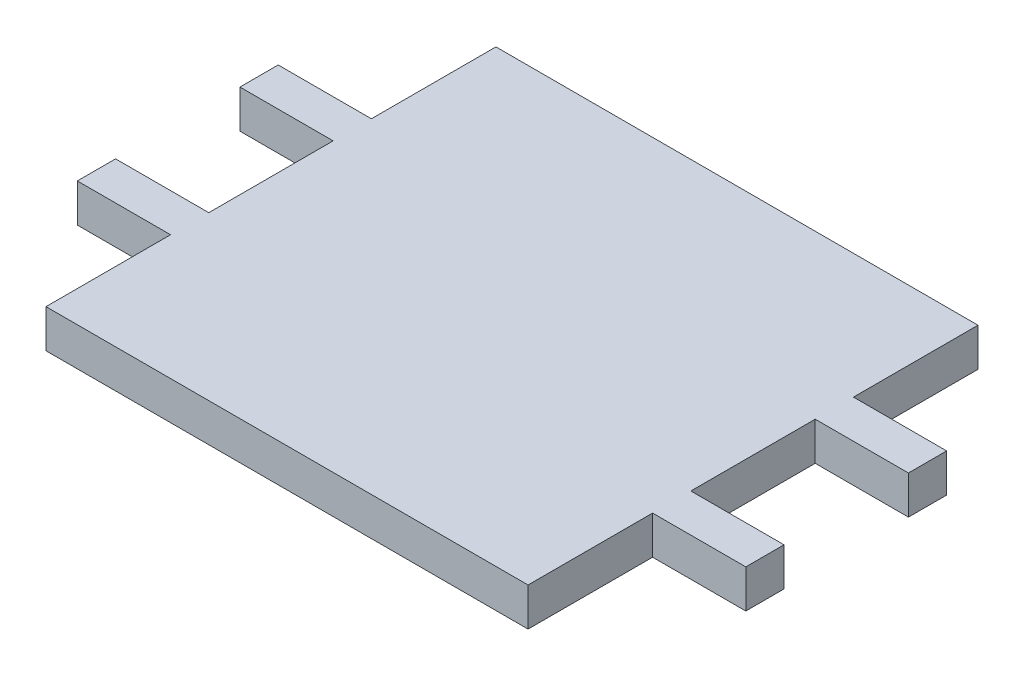
ISO-10303-21;
HEADER;
FILE_DESCRIPTION(('STEP AP214'),'2;1');
FILE_NAME('part.step','',(''),(''),'','','');
FILE_SCHEMA(('AUTOMOTIVE_DESIGN { 1 0 10303 214 1 1 1 1 }'));
ENDSEC;
DATA;
#1=APPLICATION_CONTEXT('core data for automotive mechanical design processes');
#2=APPLICATION_PROTOCOL_DEFINITION('international standard','automotive_design',2000,#1);
#3=PRODUCT_CONTEXT('',#1,'mechanical');
#4=PRODUCT('Part','Part','',(#3));
#5=PRODUCT_RELATED_PRODUCT_CATEGORY('part','',(#4));
#6=PRODUCT_DEFINITION_FORMATION('','',#4);
#7=PRODUCT_DEFINITION_CONTEXT('part definition',#1,'design');
#8=PRODUCT_DEFINITION('design','',#6,#7);
#9=PRODUCT_DEFINITION_SHAPE('','',#8);
#10=(LENGTH_UNIT() NAMED_UNIT(*) SI_UNIT(.MILLI.,.METRE.));
#11=(NAMED_UNIT(*) PLANE_ANGLE_UNIT() SI_UNIT($,.RADIAN.));
#12=(NAMED_UNIT(*) SI_UNIT($,.STERADIAN.) SOLID_ANGLE_UNIT());
#13=UNCERTAINTY_MEASURE_WITH_UNIT(LENGTH_MEASURE(1.E-05),#10,'distance_accuracy_value','');
#14=(GEOMETRIC_REPRESENTATION_CONTEXT(3) GLOBAL_UNCERTAINTY_ASSIGNED_CONTEXT((#13)) GLOBAL_UNIT_ASSIGNED_CONTEXT((#10,
#11,#12)) REPRESENTATION_CONTEXT('',''));
#15=CARTESIAN_POINT('',(0.,0.,0.));
#16=DIRECTION('',(0.,0.,1.));
#17=DIRECTION('',(1.,0.,0.));
#18=AXIS2_PLACEMENT_3D('',#15,#16,#17);
#19=CARTESIAN_POINT('',(38.1,6.0452,0.));
#20=DIRECTION('',(1.,0.,0.));
#21=DIRECTION('',(0.,0.,-1.));
#22=AXIS2_PLACEMENT_3D('',#19,#20,#21);
#23=PLANE('',#22);
#24=DIRECTION('',(0.,0.,1.));
#25=VECTOR('',#24,1.);
#26=CARTESIAN_POINT('',(38.1,0.,0.));
#27=LINE('',#26,#25);
#28=CARTESIAN_POINT('',(38.1,0.,-35.56));
#29=VERTEX_POINT('',#28);
#30=CARTESIAN_POINT('',(38.1,0.,-15.875));
#31=VERTEX_POINT('',#30);
#32=EDGE_CURVE('E211',#29,#31,#27,.T.);
#33=ORIENTED_EDGE('',*,*,#32,.F.);
#34=DIRECTION('',(0.,-1.,0.));
#35=VECTOR('',#34,1.);
#36=CARTESIAN_POINT('',(38.1,6.0452,-35.56));
#37=LINE('',#36,#35);
#38=CARTESIAN_POINT('',(38.1,6.0452,-35.56));
#39=VERTEX_POINT('',#38);
#40=EDGE_CURVE('E11',#39,#29,#37,.T.);
#41=ORIENTED_EDGE('',*,*,#40,.F.);
#42=DIRECTION('',(0.,0.,1.));
#43=VECTOR('',#42,1.);
#44=CARTESIAN_POINT('',(38.1,6.0452,0.));
#45=LINE('',#44,#43);
#46=CARTESIAN_POINT('',(38.1,6.0452,-15.875));
#47=VERTEX_POINT('',#46);
#48=EDGE_CURVE('E255',#39,#47,#45,.T.);
#49=ORIENTED_EDGE('',*,*,#48,.T.);
#50=DIRECTION('',(0.,-1.,0.));
#51=VECTOR('',#50,1.);
#52=CARTESIAN_POINT('',(38.1,6.0452,-15.875));
#53=LINE('',#52,#51);
#54=EDGE_CURVE('E133',#47,#31,#53,.T.);
#55=ORIENTED_EDGE('',*,*,#54,.T.);
#56=EDGE_LOOP('',(#33,#41,#49,#55));
#57=FACE_BOUND('',#56,.T.);
#58=ADVANCED_FACE('F46',(#57),#23,.T.);
#59=CARTESIAN_POINT('',(0.,6.0452,-35.56));
#60=DIRECTION('',(0.,0.,-1.));
#61=DIRECTION('',(-1.,0.,0.));
#62=AXIS2_PLACEMENT_3D('',#59,#60,#61);
#63=PLANE('',#62);
#64=DIRECTION('',(1.,0.,0.));
#65=VECTOR('',#64,1.);
#66=CARTESIAN_POINT('',(0.,0.,-35.56));
#67=LINE('',#66,#65);
#68=CARTESIAN_POINT('',(-38.1,0.,-35.56));
#69=VERTEX_POINT('',#68);
#70=EDGE_CURVE('E214',#69,#29,#67,.T.);
#71=ORIENTED_EDGE('',*,*,#70,.F.);
#72=DIRECTION('',(0.,-1.,0.));
#73=VECTOR('',#72,1.);
#74=CARTESIAN_POINT('',(-38.1,6.0452,-35.56));
#75=LINE('',#74,#73);
#76=CARTESIAN_POINT('',(-38.1,6.0452,-35.56));
#77=VERTEX_POINT('',#76);
#78=EDGE_CURVE('E55',#77,#69,#75,.T.);
#79=ORIENTED_EDGE('',*,*,#78,.F.);
#80=DIRECTION('',(1.,0.,0.));
#81=VECTOR('',#80,1.);
#82=CARTESIAN_POINT('',(0.,6.0452,-35.56));
#83=LINE('',#82,#81);
#84=EDGE_CURVE('E305',#77,#39,#83,.T.);
#85=ORIENTED_EDGE('',*,*,#84,.T.);
#86=ORIENTED_EDGE('',*,*,#40,.T.);
#87=EDGE_LOOP('',(#71,#79,#85,#86));
#88=FACE_BOUND('',#87,.T.);
#89=ADVANCED_FACE('F48',(#88),#63,.T.);
#90=CARTESIAN_POINT('',(-38.1,6.0452,0.));
#91=DIRECTION('',(1.,0.,0.));
#92=DIRECTION('',(0.,0.,-1.));
#93=AXIS2_PLACEMENT_3D('',#90,#91,#92);
#94=PLANE('',#93);
#95=DIRECTION('',(0.,0.,1.));
#96=VECTOR('',#95,1.);
#97=CARTESIAN_POINT('',(-38.1,0.,0.));
#98=LINE('',#97,#96);
#99=CARTESIAN_POINT('',(-38.1,0.,-15.875));
#100=VERTEX_POINT('',#99);
#101=EDGE_CURVE('E219',#69,#100,#98,.T.);
#102=ORIENTED_EDGE('',*,*,#101,.T.);
#103=DIRECTION('',(0.,-1.,0.));
#104=VECTOR('',#103,1.);
#105=CARTESIAN_POINT('',(-38.1,6.0452,-15.875));
#106=LINE('',#105,#104);
#107=CARTESIAN_POINT('',(-38.1,6.0452,-15.875));
#108=VERTEX_POINT('',#107);
#109=EDGE_CURVE('E290',#108,#100,#106,.T.);
#110=ORIENTED_EDGE('',*,*,#109,.F.);
#111=DIRECTION('',(0.,0.,1.));
#112=VECTOR('',#111,1.);
#113=CARTESIAN_POINT('',(-38.1,6.0452,0.));
#114=LINE('',#113,#112);
#115=EDGE_CURVE('E296',#77,#108,#114,.T.);
#116=ORIENTED_EDGE('',*,*,#115,.F.);
#117=ORIENTED_EDGE('',*,*,#78,.T.);
#118=EDGE_LOOP('',(#102,#110,#116,#117));
#119=FACE_BOUND('',#118,.T.);
#120=ADVANCED_FACE('F294',(#119),#94,.F.);
#121=CARTESIAN_POINT('',(0.,6.0452,-15.875));
#122=DIRECTION('',(0.,0.,-1.));
#123=DIRECTION('',(-1.,0.,0.));
#124=AXIS2_PLACEMENT_3D('',#121,#122,#123);
#125=PLANE('',#124);
#126=DIRECTION('',(1.,0.,0.));
#127=VECTOR('',#126,1.);
#128=CARTESIAN_POINT('',(0.,0.,-15.875));
#129=LINE('',#128,#127);
#130=CARTESIAN_POINT('',(-52.832,0.,-15.875));
#131=VERTEX_POINT('',#130);
#132=EDGE_CURVE('E222',#131,#100,#129,.T.);
#133=ORIENTED_EDGE('',*,*,#132,.F.);
#134=DIRECTION('',(0.,-1.,0.));
#135=VECTOR('',#134,1.);
#136=CARTESIAN_POINT('',(-52.832,6.0452,-15.875));
#137=LINE('',#136,#135);
#138=CARTESIAN_POINT('',(-52.832,6.0452,-15.875));
#139=VERTEX_POINT('',#138);
#140=EDGE_CURVE('E288',#139,#131,#137,.T.);
#141=ORIENTED_EDGE('',*,*,#140,.F.);
#142=DIRECTION('',(1.,0.,0.));
#143=VECTOR('',#142,1.);
#144=CARTESIAN_POINT('',(0.,6.0452,-15.875));
#145=LINE('',#144,#143);
#146=EDGE_CURVE('E378',#139,#108,#145,.T.);
#147=ORIENTED_EDGE('',*,*,#146,.T.);
#148=ORIENTED_EDGE('',*,*,#109,.T.);
#149=EDGE_LOOP('',(#133,#141,#147,#148));
#150=FACE_BOUND('',#149,.T.);
#151=ADVANCED_FACE('F382',(#150),#125,.T.);
#152=CARTESIAN_POINT('',(-52.832,6.0452,0.));
#153=DIRECTION('',(1.,0.,0.));
#154=DIRECTION('',(0.,0.,-1.));
#155=AXIS2_PLACEMENT_3D('',#152,#153,#154);
#156=PLANE('',#155);
#157=DIRECTION('',(0.,0.,1.));
#158=VECTOR('',#157,1.);
#159=CARTESIAN_POINT('',(-52.832,0.,0.));
#160=LINE('',#159,#158);
#161=CARTESIAN_POINT('',(-52.832,0.,-9.8298));
#162=VERTEX_POINT('',#161);
#163=EDGE_CURVE('E227',#131,#162,#160,.T.);
#164=ORIENTED_EDGE('',*,*,#163,.T.);
#165=DIRECTION('',(0.,-1.,0.));
#166=VECTOR('',#165,1.);
#167=CARTESIAN_POINT('',(-52.832,6.0452,-9.8298));
#168=LINE('',#167,#166);
#169=CARTESIAN_POINT('',(-52.832,6.0452,-9.8298));
#170=VERTEX_POINT('',#169);
#171=EDGE_CURVE('E285',#170,#162,#168,.T.);
#172=ORIENTED_EDGE('',*,*,#171,.F.);
#173=DIRECTION('',(0.,0.,1.));
#174=VECTOR('',#173,1.);
#175=CARTESIAN_POINT('',(-52.832,6.0452,0.));
#176=LINE('',#175,#174);
#177=EDGE_CURVE('E376',#139,#170,#176,.T.);
#178=ORIENTED_EDGE('',*,*,#177,.F.);
#179=ORIENTED_EDGE('',*,*,#140,.T.);
#180=EDGE_LOOP('',(#164,#172,#178,#179));
#181=FACE_BOUND('',#180,.T.);
#182=ADVANCED_FACE('F386',(#181),#156,.F.);
#183=CARTESIAN_POINT('',(0.,6.0452,-9.8298));
#184=DIRECTION('',(0.,0.,-1.));
#185=DIRECTION('',(-1.,0.,0.));
#186=AXIS2_PLACEMENT_3D('',#183,#184,#185);
#187=PLANE('',#186);
#188=DIRECTION('',(1.,0.,0.));
#189=VECTOR('',#188,1.);
#190=CARTESIAN_POINT('',(0.,0.,-9.8298));
#191=LINE('',#190,#189);
#192=CARTESIAN_POINT('',(-38.1,0.,-9.8298));
#193=VERTEX_POINT('',#192);
#194=EDGE_CURVE('E229',#162,#193,#191,.T.);
#195=ORIENTED_EDGE('',*,*,#194,.T.);
#196=DIRECTION('',(0.,-1.,0.));
#197=VECTOR('',#196,1.);
#198=CARTESIAN_POINT('',(-38.1,6.0452,-9.8298));
#199=LINE('',#198,#197);
#200=CARTESIAN_POINT('',(-38.1,6.0452,-9.8298));
#201=VERTEX_POINT('',#200);
#202=EDGE_CURVE('E282',#201,#193,#199,.T.);
#203=ORIENTED_EDGE('',*,*,#202,.F.);
#204=DIRECTION('',(1.,0.,0.));
#205=VECTOR('',#204,1.);
#206=CARTESIAN_POINT('',(0.,6.0452,-9.8298));
#207=LINE('',#206,#205);
#208=EDGE_CURVE('E373',#170,#201,#207,.T.);
#209=ORIENTED_EDGE('',*,*,#208,.F.);
#210=ORIENTED_EDGE('',*,*,#171,.T.);
#211=EDGE_LOOP('',(#195,#203,#209,#210));
#212=FACE_BOUND('',#211,.T.);
#213=ADVANCED_FACE('F389',(#212),#187,.F.);
#214=CARTESIAN_POINT('',(-38.1,0.,9.8298));
#215=VERTEX_POINT('',#214);
#216=EDGE_CURVE('E224',#193,#215,#98,.T.);
#217=ORIENTED_EDGE('',*,*,#216,.T.);
#218=DIRECTION('',(0.,-1.,0.));
#219=VECTOR('',#218,1.);
#220=CARTESIAN_POINT('',(-38.1,6.0452,9.8298));
#221=LINE('',#220,#219);
#222=CARTESIAN_POINT('',(-38.1,6.0452,9.8298));
#223=VERTEX_POINT('',#222);
#224=EDGE_CURVE('E280',#223,#215,#221,.T.);
#225=ORIENTED_EDGE('',*,*,#224,.F.);
#226=EDGE_CURVE('E325',#201,#223,#114,.T.);
#227=ORIENTED_EDGE('',*,*,#226,.F.);
#228=ORIENTED_EDGE('',*,*,#202,.T.);
#229=EDGE_LOOP('',(#217,#225,#227,#228));
#230=FACE_BOUND('',#229,.T.);
#231=ADVANCED_FACE('F359',(#230),#94,.F.);
#232=CARTESIAN_POINT('',(0.,6.0452,9.8298));
#233=DIRECTION('',(0.,0.,-1.));
#234=DIRECTION('',(-1.,0.,0.));
#235=AXIS2_PLACEMENT_3D('',#232,#233,#234);
#236=PLANE('',#235);
#237=DIRECTION('',(1.,0.,0.));
#238=VECTOR('',#237,1.);
#239=CARTESIAN_POINT('',(0.,0.,9.8298));
#240=LINE('',#239,#238);
#241=CARTESIAN_POINT('',(-52.832,0.,9.8298));
#242=VERTEX_POINT('',#241);
#243=EDGE_CURVE('E231',#242,#215,#240,.T.);
#244=ORIENTED_EDGE('',*,*,#243,.F.);
#245=DIRECTION('',(0.,-1.,0.));
#246=VECTOR('',#245,1.);
#247=CARTESIAN_POINT('',(-52.832,6.0452,9.8298));
#248=LINE('',#247,#246);
#249=CARTESIAN_POINT('',(-52.832,6.0452,9.8298));
#250=VERTEX_POINT('',#249);
#251=EDGE_CURVE('E278',#250,#242,#248,.T.);
#252=ORIENTED_EDGE('',*,*,#251,.F.);
#253=DIRECTION('',(1.,0.,0.));
#254=VECTOR('',#253,1.);
#255=CARTESIAN_POINT('',(0.,6.0452,9.8298));
#256=LINE('',#255,#254);
#257=EDGE_CURVE('E370',#250,#223,#256,.T.);
#258=ORIENTED_EDGE('',*,*,#257,.T.);
#259=ORIENTED_EDGE('',*,*,#224,.T.);
#260=EDGE_LOOP('',(#244,#252,#258,#259));
#261=FACE_BOUND('',#260,.T.);
#262=ADVANCED_FACE('F367',(#261),#236,.T.);
#263=CARTESIAN_POINT('',(-52.832,6.0452,0.));
#264=DIRECTION('',(1.,0.,0.));
#265=DIRECTION('',(0.,0.,-1.));
#266=AXIS2_PLACEMENT_3D('',#263,#264,#265);
#267=PLANE('',#266);
#268=DIRECTION('',(0.,0.,1.));
#269=VECTOR('',#268,1.);
#270=CARTESIAN_POINT('',(-52.832,0.,0.));
#271=LINE('',#270,#269);
#272=CARTESIAN_POINT('',(-52.832,0.,15.875));
#273=VERTEX_POINT('',#272);
#274=EDGE_CURVE('E234',#242,#273,#271,.T.);
#275=ORIENTED_EDGE('',*,*,#274,.T.);
#276=DIRECTION('',(0.,-1.,0.));
#277=VECTOR('',#276,1.);
#278=CARTESIAN_POINT('',(-52.832,6.0452,15.875));
#279=LINE('',#278,#277);
#280=CARTESIAN_POINT('',(-52.832,6.0452,15.875));
#281=VERTEX_POINT('',#280);
#282=EDGE_CURVE('E275',#281,#273,#279,.T.);
#283=ORIENTED_EDGE('',*,*,#282,.F.);
#284=DIRECTION('',(0.,0.,1.));
#285=VECTOR('',#284,1.);
#286=CARTESIAN_POINT('',(-52.832,6.0452,0.));
#287=LINE('',#286,#285);
#288=EDGE_CURVE('E371',#250,#281,#287,.T.);
#289=ORIENTED_EDGE('',*,*,#288,.F.);
#290=ORIENTED_EDGE('',*,*,#251,.T.);
#291=EDGE_LOOP('',(#275,#283,#289,#290));
#292=FACE_BOUND('',#291,.T.);
#293=ADVANCED_FACE('F429',(#292),#267,.F.);
#294=CARTESIAN_POINT('',(0.,6.0452,15.875));
#295=DIRECTION('',(0.,0.,-1.));
#296=DIRECTION('',(-1.,0.,0.));
#297=AXIS2_PLACEMENT_3D('',#294,#295,#296);
#298=PLANE('',#297);
#299=DIRECTION('',(1.,0.,0.));
#300=VECTOR('',#299,1.);
#301=CARTESIAN_POINT('',(0.,0.,15.875));
#302=LINE('',#301,#300);
#303=CARTESIAN_POINT('',(-38.1,0.,15.875));
#304=VERTEX_POINT('',#303);
#305=EDGE_CURVE('E236',#273,#304,#302,.T.);
#306=ORIENTED_EDGE('',*,*,#305,.T.);
#307=DIRECTION('',(0.,-1.,0.));
#308=VECTOR('',#307,1.);
#309=CARTESIAN_POINT('',(-38.1,6.0452,15.875));
#310=LINE('',#309,#308);
#311=CARTESIAN_POINT('',(-38.1,6.0452,15.875));
#312=VERTEX_POINT('',#311);
#313=EDGE_CURVE('E272',#312,#304,#310,.T.);
#314=ORIENTED_EDGE('',*,*,#313,.F.);
#315=DIRECTION('',(1.,0.,0.));
#316=VECTOR('',#315,1.);
#317=CARTESIAN_POINT('',(0.,6.0452,15.875));
#318=LINE('',#317,#316);
#319=EDGE_CURVE('E323',#281,#312,#318,.T.);
#320=ORIENTED_EDGE('',*,*,#319,.F.);
#321=ORIENTED_EDGE('',*,*,#282,.T.);
#322=EDGE_LOOP('',(#306,#314,#320,#321));
#323=FACE_BOUND('',#322,.T.);
#324=ADVANCED_FACE('F426',(#323),#298,.F.);
#325=CARTESIAN_POINT('',(-38.1,0.,35.56));
#326=VERTEX_POINT('',#325);
#327=EDGE_CURVE('E223',#304,#326,#98,.T.);
#328=ORIENTED_EDGE('',*,*,#327,.T.);
#329=DIRECTION('',(0.,-1.,0.));
#330=VECTOR('',#329,1.);
#331=CARTESIAN_POINT('',(-38.1,6.0452,35.56));
#332=LINE('',#331,#330);
#333=CARTESIAN_POINT('',(-38.1,6.0452,35.56));
#334=VERTEX_POINT('',#333);
#335=EDGE_CURVE('E269',#334,#326,#332,.T.);
#336=ORIENTED_EDGE('',*,*,#335,.F.);
#337=EDGE_CURVE('E319',#312,#334,#114,.T.);
#338=ORIENTED_EDGE('',*,*,#337,.F.);
#339=ORIENTED_EDGE('',*,*,#313,.T.);
#340=EDGE_LOOP('',(#328,#336,#338,#339));
#341=FACE_BOUND('',#340,.T.);
#342=ADVANCED_FACE('F352',(#341),#94,.F.);
#343=CARTESIAN_POINT('',(0.,6.0452,35.56));
#344=DIRECTION('',(0.,0.,-1.));
#345=DIRECTION('',(-1.,0.,0.));
#346=AXIS2_PLACEMENT_3D('',#343,#344,#345);
#347=PLANE('',#346);
#348=DIRECTION('',(1.,0.,0.));
#349=VECTOR('',#348,1.);
#350=CARTESIAN_POINT('',(0.,0.,35.56));
#351=LINE('',#350,#349);
#352=CARTESIAN_POINT('',(38.1,0.,35.56));
#353=VERTEX_POINT('',#352);
#354=EDGE_CURVE('E238',#326,#353,#351,.T.);
#355=ORIENTED_EDGE('',*,*,#354,.T.);
#356=DIRECTION('',(0.,-1.,0.));
#357=VECTOR('',#356,1.);
#358=CARTESIAN_POINT('',(38.1,6.0452,35.56));
#359=LINE('',#358,#357);
#360=CARTESIAN_POINT('',(38.1,6.0452,35.56));
#361=VERTEX_POINT('',#360);
#362=EDGE_CURVE('E267',#361,#353,#359,.T.);
#363=ORIENTED_EDGE('',*,*,#362,.F.);
#364=DIRECTION('',(1.,0.,0.));
#365=VECTOR('',#364,1.);
#366=CARTESIAN_POINT('',(0.,6.0452,35.56));
#367=LINE('',#366,#365);
#368=EDGE_CURVE('E313',#334,#361,#367,.T.);
#369=ORIENTED_EDGE('',*,*,#368,.F.);
#370=ORIENTED_EDGE('',*,*,#335,.T.);
#371=EDGE_LOOP('',(#355,#363,#369,#370));
#372=FACE_BOUND('',#371,.T.);
#373=ADVANCED_FACE('F348',(#372),#347,.F.);
#374=CARTESIAN_POINT('',(38.1,0.,15.875));
#375=VERTEX_POINT('',#374);
#376=EDGE_CURVE('E216',#375,#353,#27,.T.);
#377=ORIENTED_EDGE('',*,*,#376,.F.);
#378=DIRECTION('',(0.,-1.,0.));
#379=VECTOR('',#378,1.);
#380=CARTESIAN_POINT('',(38.1,6.0452,15.875));
#381=LINE('',#380,#379);
#382=CARTESIAN_POINT('',(38.1,6.0452,15.875));
#383=VERTEX_POINT('',#382);
#384=EDGE_CURVE('E265',#383,#375,#381,.T.);
#385=ORIENTED_EDGE('',*,*,#384,.F.);
#386=EDGE_CURVE('E308',#383,#361,#45,.T.);
#387=ORIENTED_EDGE('',*,*,#386,.T.);
#388=ORIENTED_EDGE('',*,*,#362,.T.);
#389=EDGE_LOOP('',(#377,#385,#387,#388));
#390=FACE_BOUND('',#389,.T.);
#391=ADVANCED_FACE('F346',(#390),#23,.T.);
#392=CARTESIAN_POINT('',(0.,6.0452,15.875));
#393=DIRECTION('',(0.,0.,1.));
#394=DIRECTION('',(1.,0.,0.));
#395=AXIS2_PLACEMENT_3D('',#392,#393,#394);
#396=PLANE('',#395);
#397=DIRECTION('',(-1.,0.,0.));
#398=VECTOR('',#397,1.);
#399=CARTESIAN_POINT('',(0.,0.,15.875));
#400=LINE('',#399,#398);
#401=CARTESIAN_POINT('',(52.832,0.,15.875));
#402=VERTEX_POINT('',#401);
#403=EDGE_CURVE('E241',#402,#375,#400,.T.);
#404=ORIENTED_EDGE('',*,*,#403,.F.);
#405=DIRECTION('',(0.,-1.,0.));
#406=VECTOR('',#405,1.);
#407=CARTESIAN_POINT('',(52.832,6.0452,15.875));
#408=LINE('',#407,#406);
#409=CARTESIAN_POINT('',(52.832,6.0452,15.875));
#410=VERTEX_POINT('',#409);
#411=EDGE_CURVE('E263',#410,#402,#408,.T.);
#412=ORIENTED_EDGE('',*,*,#411,.F.);
#413=DIRECTION('',(-1.,0.,0.));
#414=VECTOR('',#413,1.);
#415=CARTESIAN_POINT('',(0.,6.0452,15.875));
#416=LINE('',#415,#414);
#417=EDGE_CURVE('E312',#410,#383,#416,.T.);
#418=ORIENTED_EDGE('',*,*,#417,.T.);
#419=ORIENTED_EDGE('',*,*,#384,.T.);
#420=EDGE_LOOP('',(#404,#412,#418,#419));
#421=FACE_BOUND('',#420,.T.);
#422=ADVANCED_FACE('F407',(#421),#396,.T.);
#423=CARTESIAN_POINT('',(52.832,6.0452,0.));
#424=DIRECTION('',(1.,0.,0.));
#425=DIRECTION('',(0.,0.,-1.));
#426=AXIS2_PLACEMENT_3D('',#423,#424,#425);
#427=PLANE('',#426);
#428=DIRECTION('',(0.,0.,1.));
#429=VECTOR('',#428,1.);
#430=CARTESIAN_POINT('',(52.832,0.,0.));
#431=LINE('',#430,#429);
#432=CARTESIAN_POINT('',(52.832,0.,9.82979999999999));
#433=VERTEX_POINT('',#432);
#434=EDGE_CURVE('E244',#433,#402,#431,.T.);
#435=ORIENTED_EDGE('',*,*,#434,.F.);
#436=DIRECTION('',(0.,-1.,0.));
#437=VECTOR('',#436,1.);
#438=CARTESIAN_POINT('',(52.832,6.0452,9.82979999999999));
#439=LINE('',#438,#437);
#440=CARTESIAN_POINT('',(52.832,6.0452,9.82979999999999));
#441=VERTEX_POINT('',#440);
#442=EDGE_CURVE('E261',#441,#433,#439,.T.);
#443=ORIENTED_EDGE('',*,*,#442,.F.);
#444=DIRECTION('',(0.,0.,1.));
#445=VECTOR('',#444,1.);
#446=CARTESIAN_POINT('',(52.832,6.0452,0.));
#447=LINE('',#446,#445);
#448=EDGE_CURVE('E317',#441,#410,#447,.T.);
#449=ORIENTED_EDGE('',*,*,#448,.T.);
#450=ORIENTED_EDGE('',*,*,#411,.T.);
#451=EDGE_LOOP('',(#435,#443,#449,#450));
#452=FACE_BOUND('',#451,.T.);
#453=ADVANCED_FACE('F413',(#452),#427,.T.);
#454=CARTESIAN_POINT('',(0.,6.0452,9.8298));
#455=DIRECTION('',(0.,0.,1.));
#456=DIRECTION('',(1.,0.,0.));
#457=AXIS2_PLACEMENT_3D('',#454,#455,#456);
#458=PLANE('',#457);
#459=DIRECTION('',(-1.,0.,0.));
#460=VECTOR('',#459,1.);
#461=CARTESIAN_POINT('',(0.,0.,9.8298));
#462=LINE('',#461,#460);
#463=CARTESIAN_POINT('',(38.1,0.,9.82979999999999));
#464=VERTEX_POINT('',#463);
#465=EDGE_CURVE('E247',#433,#464,#462,.T.);
#466=ORIENTED_EDGE('',*,*,#465,.T.);
#467=DIRECTION('',(0.,-1.,0.));
#468=VECTOR('',#467,1.);
#469=CARTESIAN_POINT('',(38.1,6.0452,9.82979999999999));
#470=LINE('',#469,#468);
#471=CARTESIAN_POINT('',(38.1,6.0452,9.82979999999999));
#472=VERTEX_POINT('',#471);
#473=EDGE_CURVE('E259',#472,#464,#470,.T.);
#474=ORIENTED_EDGE('',*,*,#473,.F.);
#475=DIRECTION('',(-1.,0.,0.));
#476=VECTOR('',#475,1.);
#477=CARTESIAN_POINT('',(0.,6.0452,9.8298));
#478=LINE('',#477,#476);
#479=EDGE_CURVE('E310',#441,#472,#478,.T.);
#480=ORIENTED_EDGE('',*,*,#479,.F.);
#481=ORIENTED_EDGE('',*,*,#442,.T.);
#482=EDGE_LOOP('',(#466,#474,#480,#481));
#483=FACE_BOUND('',#482,.T.);
#484=ADVANCED_FACE('F335',(#483),#458,.F.);
#485=CARTESIAN_POINT('',(38.1,0.,-9.82980000000001));
#486=VERTEX_POINT('',#485);
#487=EDGE_CURVE('E215',#486,#464,#27,.T.);
#488=ORIENTED_EDGE('',*,*,#487,.F.);
#489=DIRECTION('',(0.,-1.,0.));
#490=VECTOR('',#489,1.);
#491=CARTESIAN_POINT('',(38.1,6.0452,-9.82980000000001));
#492=LINE('',#491,#490);
#493=CARTESIAN_POINT('',(38.1,6.0452,-9.82980000000001));
#494=VERTEX_POINT('',#493);
#495=EDGE_CURVE('E198',#494,#486,#492,.T.);
#496=ORIENTED_EDGE('',*,*,#495,.F.);
#497=EDGE_CURVE('E204',#494,#472,#45,.T.);
#498=ORIENTED_EDGE('',*,*,#497,.T.);
#499=ORIENTED_EDGE('',*,*,#473,.T.);
#500=EDGE_LOOP('',(#488,#496,#498,#499));
#501=FACE_BOUND('',#500,.T.);
#502=ADVANCED_FACE('F340',(#501),#23,.T.);
#503=CARTESIAN_POINT('',(0.,6.0452,-9.8298));
#504=DIRECTION('',(0.,0.,1.));
#505=DIRECTION('',(1.,0.,0.));
#506=AXIS2_PLACEMENT_3D('',#503,#504,#505);
#507=PLANE('',#506);
#508=DIRECTION('',(-1.,0.,0.));
#509=VECTOR('',#508,1.);
#510=CARTESIAN_POINT('',(0.,0.,-9.8298));
#511=LINE('',#510,#509);
#512=CARTESIAN_POINT('',(52.832,0.,-9.82980000000001));
#513=VERTEX_POINT('',#512);
#514=EDGE_CURVE('E193',#513,#486,#511,.T.);
#515=ORIENTED_EDGE('',*,*,#514,.F.);
#516=DIRECTION('',(0.,-1.,0.));
#517=VECTOR('',#516,1.);
#518=CARTESIAN_POINT('',(52.832,6.0452,-9.82980000000001));
#519=LINE('',#518,#517);
#520=CARTESIAN_POINT('',(52.832,6.0452,-9.82980000000001));
#521=VERTEX_POINT('',#520);
#522=EDGE_CURVE('E188',#521,#513,#519,.T.);
#523=ORIENTED_EDGE('',*,*,#522,.F.);
#524=DIRECTION('',(-1.,0.,0.));
#525=VECTOR('',#524,1.);
#526=CARTESIAN_POINT('',(0.,6.0452,-9.8298));
#527=LINE('',#526,#525);
#528=EDGE_CURVE('E191',#521,#494,#527,.T.);
#529=ORIENTED_EDGE('',*,*,#528,.T.);
#530=ORIENTED_EDGE('',*,*,#495,.T.);
#531=EDGE_LOOP('',(#515,#523,#529,#530));
#532=FACE_BOUND('',#531,.T.);
#533=ADVANCED_FACE('F190',(#532),#507,.T.);
#534=CARTESIAN_POINT('',(52.832,6.0452,0.));
#535=DIRECTION('',(1.,0.,0.));
#536=DIRECTION('',(0.,0.,-1.));
#537=AXIS2_PLACEMENT_3D('',#534,#535,#536);
#538=PLANE('',#537);
#539=DIRECTION('',(0.,0.,1.));
#540=VECTOR('',#539,1.);
#541=CARTESIAN_POINT('',(52.832,0.,0.));
#542=LINE('',#541,#540);
#543=CARTESIAN_POINT('',(52.832,0.,-15.875));
#544=VERTEX_POINT('',#543);
#545=EDGE_CURVE('E251',#544,#513,#542,.T.);
#546=ORIENTED_EDGE('',*,*,#545,.F.);
#547=DIRECTION('',(0.,-1.,0.));
#548=VECTOR('',#547,1.);
#549=CARTESIAN_POINT('',(52.832,6.0452,-15.875));
#550=LINE('',#549,#548);
#551=CARTESIAN_POINT('',(52.832,6.0452,-15.875));
#552=VERTEX_POINT('',#551);
#553=EDGE_CURVE('E126',#552,#544,#550,.T.);
#554=ORIENTED_EDGE('',*,*,#553,.F.);
#555=DIRECTION('',(0.,0.,1.));
#556=VECTOR('',#555,1.);
#557=CARTESIAN_POINT('',(52.832,6.0452,0.));
#558=LINE('',#557,#556);
#559=EDGE_CURVE('E202',#552,#521,#558,.T.);
#560=ORIENTED_EDGE('',*,*,#559,.T.);
#561=ORIENTED_EDGE('',*,*,#522,.T.);
#562=EDGE_LOOP('',(#546,#554,#560,#561));
#563=FACE_BOUND('',#562,.T.);
#564=ADVANCED_FACE('F206',(#563),#538,.T.);
#565=CARTESIAN_POINT('',(0.,6.0452,-15.875));
#566=DIRECTION('',(0.,0.,1.));
#567=DIRECTION('',(1.,0.,0.));
#568=AXIS2_PLACEMENT_3D('',#565,#566,#567);
#569=PLANE('',#568);
#570=DIRECTION('',(-1.,0.,0.));
#571=VECTOR('',#570,1.);
#572=CARTESIAN_POINT('',(0.,0.,-15.875));
#573=LINE('',#572,#571);
#574=EDGE_CURVE('E253',#544,#31,#573,.T.);
#575=ORIENTED_EDGE('',*,*,#574,.T.);
#576=ORIENTED_EDGE('',*,*,#54,.F.);
#577=DIRECTION('',(-1.,0.,0.));
#578=VECTOR('',#577,1.);
#579=CARTESIAN_POINT('',(0.,6.0452,-15.875));
#580=LINE('',#579,#578);
#581=EDGE_CURVE('E63',#552,#47,#580,.T.);
#582=ORIENTED_EDGE('',*,*,#581,.F.);
#583=ORIENTED_EDGE('',*,*,#553,.T.);
#584=EDGE_LOOP('',(#575,#576,#582,#583));
#585=FACE_BOUND('',#584,.T.);
#586=ADVANCED_FACE('F306',(#585),#569,.F.);
#587=CARTESIAN_POINT('',(0.,6.0452,0.));
#588=DIRECTION('',(0.,1.,0.));
#589=DIRECTION('',(0.,0.,1.));
#590=AXIS2_PLACEMENT_3D('',#587,#588,#589);
#591=PLANE('',#590);
#592=ORIENTED_EDGE('',*,*,#48,.F.);
#593=ORIENTED_EDGE('',*,*,#84,.F.);
#594=ORIENTED_EDGE('',*,*,#115,.T.);
#595=ORIENTED_EDGE('',*,*,#146,.F.);
#596=ORIENTED_EDGE('',*,*,#177,.T.);
#597=ORIENTED_EDGE('',*,*,#208,.T.);
#598=ORIENTED_EDGE('',*,*,#226,.T.);
#599=ORIENTED_EDGE('',*,*,#257,.F.);
#600=ORIENTED_EDGE('',*,*,#288,.T.);
#601=ORIENTED_EDGE('',*,*,#319,.T.);
#602=ORIENTED_EDGE('',*,*,#337,.T.);
#603=ORIENTED_EDGE('',*,*,#368,.T.);
#604=ORIENTED_EDGE('',*,*,#386,.F.);
#605=ORIENTED_EDGE('',*,*,#417,.F.);
#606=ORIENTED_EDGE('',*,*,#448,.F.);
#607=ORIENTED_EDGE('',*,*,#479,.T.);
#608=ORIENTED_EDGE('',*,*,#497,.F.);
#609=ORIENTED_EDGE('',*,*,#528,.F.);
#610=ORIENTED_EDGE('',*,*,#559,.F.);
#611=ORIENTED_EDGE('',*,*,#581,.T.);
#612=EDGE_LOOP('',(#592,#593,#594,#595,#596,#597,#598,#599,#600,#601,#602,#603,#604,#605,#606,
#607,#608,#609,#610,#611));
#613=FACE_BOUND('',#612,.T.);
#614=ADVANCED_FACE('F201',(#613),#591,.T.);
#615=CARTESIAN_POINT('',(0.,0.,0.));
#616=DIRECTION('',(0.,1.,0.));
#617=DIRECTION('',(0.,0.,1.));
#618=AXIS2_PLACEMENT_3D('',#615,#616,#617);
#619=PLANE('',#618);
#620=ORIENTED_EDGE('',*,*,#32,.T.);
#621=ORIENTED_EDGE('',*,*,#574,.F.);
#622=ORIENTED_EDGE('',*,*,#545,.T.);
#623=ORIENTED_EDGE('',*,*,#514,.T.);
#624=ORIENTED_EDGE('',*,*,#487,.T.);
#625=ORIENTED_EDGE('',*,*,#465,.F.);
#626=ORIENTED_EDGE('',*,*,#434,.T.);
#627=ORIENTED_EDGE('',*,*,#403,.T.);
#628=ORIENTED_EDGE('',*,*,#376,.T.);
#629=ORIENTED_EDGE('',*,*,#354,.F.);
#630=ORIENTED_EDGE('',*,*,#327,.F.);
#631=ORIENTED_EDGE('',*,*,#305,.F.);
#632=ORIENTED_EDGE('',*,*,#274,.F.);
#633=ORIENTED_EDGE('',*,*,#243,.T.);
#634=ORIENTED_EDGE('',*,*,#216,.F.);
#635=ORIENTED_EDGE('',*,*,#194,.F.);
#636=ORIENTED_EDGE('',*,*,#163,.F.);
#637=ORIENTED_EDGE('',*,*,#132,.T.);
#638=ORIENTED_EDGE('',*,*,#101,.F.);
#639=ORIENTED_EDGE('',*,*,#70,.T.);
#640=EDGE_LOOP('',(#620,#621,#622,#623,#624,#625,#626,#627,#628,#629,#630,#631,#632,#633,#634,
#635,#636,#637,#638,#639));
#641=FACE_BOUND('',#640,.T.);
#642=ADVANCED_FACE('F302',(#641),#619,.F.);
#643=CLOSED_SHELL('',(#58,#89,#120,#151,#182,#213,#231,#262,#293,#324,#342,#373,#391,#422,#453,
#484,#502,#533,#564,#586,#614,#642));
#644=MANIFOLD_SOLID_BREP('B2',#643);
#645=ADVANCED_BREP_SHAPE_REPRESENTATION('',(#18,#644),#14);
#646=SHAPE_DEFINITION_REPRESENTATION(#9,#645);
ENDSEC;
END-ISO-10303-21;
